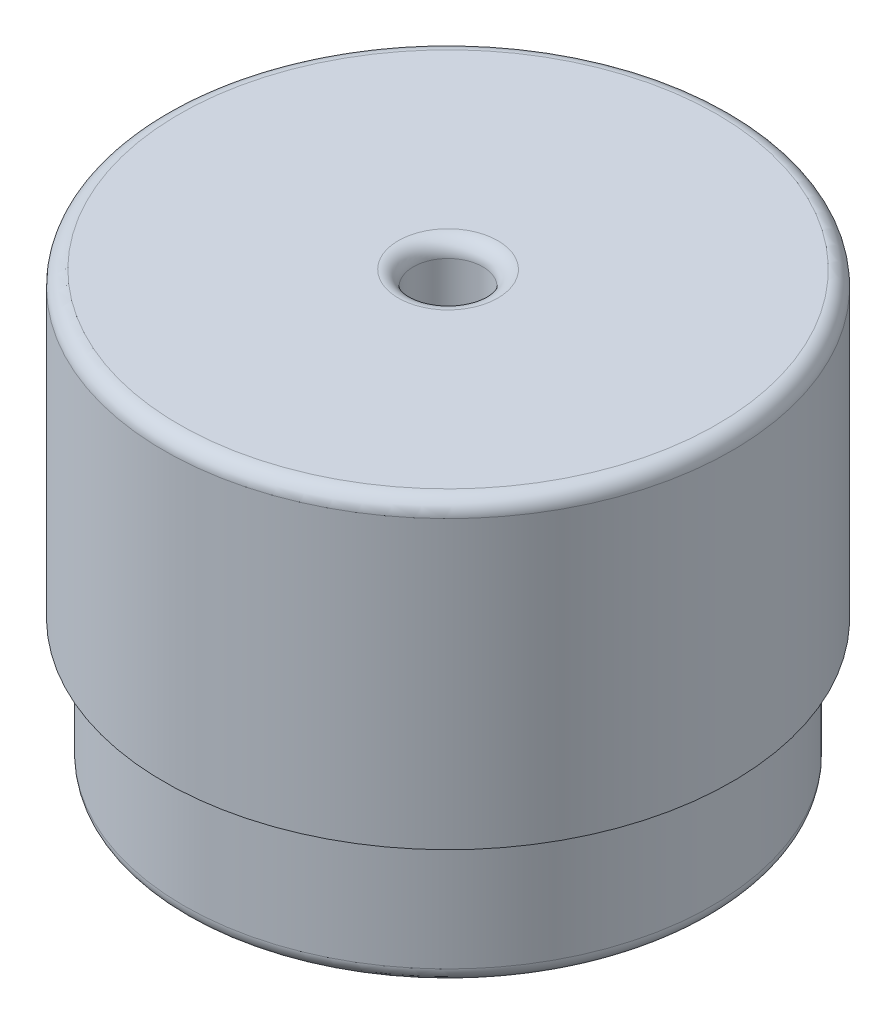
ISO-10303-21;
HEADER;
FILE_DESCRIPTION(('STEP AP214'),'2;1');
FILE_NAME('part.step','',(''),(''),'','','');
FILE_SCHEMA(('AUTOMOTIVE_DESIGN { 1 0 10303 214 1 1 1 1 }'));
ENDSEC;
DATA;
#1=APPLICATION_CONTEXT('core data for automotive mechanical design processes');
#2=APPLICATION_PROTOCOL_DEFINITION('international standard','automotive_design',2000,#1);
#3=PRODUCT_CONTEXT('',#1,'mechanical');
#4=PRODUCT('Part','Part','',(#3));
#5=PRODUCT_RELATED_PRODUCT_CATEGORY('part','',(#4));
#6=PRODUCT_DEFINITION_FORMATION('','',#4);
#7=PRODUCT_DEFINITION_CONTEXT('part definition',#1,'design');
#8=PRODUCT_DEFINITION('design','',#6,#7);
#9=PRODUCT_DEFINITION_SHAPE('','',#8);
#10=(LENGTH_UNIT() NAMED_UNIT(*) SI_UNIT(.MILLI.,.METRE.));
#11=(NAMED_UNIT(*) PLANE_ANGLE_UNIT() SI_UNIT($,.RADIAN.));
#12=(NAMED_UNIT(*) SI_UNIT($,.STERADIAN.) SOLID_ANGLE_UNIT());
#13=UNCERTAINTY_MEASURE_WITH_UNIT(LENGTH_MEASURE(1.E-05),#10,'distance_accuracy_value','');
#14=(GEOMETRIC_REPRESENTATION_CONTEXT(3) GLOBAL_UNCERTAINTY_ASSIGNED_CONTEXT((#13)) GLOBAL_UNIT_ASSIGNED_CONTEXT((#10,
#11,#12)) REPRESENTATION_CONTEXT('',''));
#15=CARTESIAN_POINT('',(0.,0.,0.));
#16=DIRECTION('',(0.,0.,1.));
#17=DIRECTION('',(1.,0.,0.));
#18=AXIS2_PLACEMENT_3D('',#15,#16,#17);
#19=CARTESIAN_POINT('',(0.,-11.8133333266984,0.));
#20=DIRECTION('',(0.,-1.,0.));
#21=DIRECTION('',(0.,0.,-1.));
#22=AXIS2_PLACEMENT_3D('',#19,#20,#21);
#23=TOROIDAL_SURFACE('',#22,5.0125,1.52);
#24=CARTESIAN_POINT('',(0.,-13.3333333266984,0.));
#25=DIRECTION('',(0.,-1.,0.));
#26=DIRECTION('',(0.,0.,-1.));
#27=AXIS2_PLACEMENT_3D('',#24,#25,#26);
#28=CIRCLE('',#27,5.0125);
#29=CARTESIAN_POINT('',(0.,-13.3333333266984,-5.0125));
#30=VERTEX_POINT('',#29);
#31=EDGE_CURVE('E10',#30,#30,#28,.T.);
#32=ORIENTED_EDGE('',*,*,#31,.T.);
#33=EDGE_LOOP('',(#32));
#34=FACE_BOUND('',#33,.T.);
#35=CARTESIAN_POINT('',(0.,-11.8133333266984,0.));
#36=DIRECTION('',(0.,-1.,0.));
#37=DIRECTION('',(0.,0.,-1.));
#38=AXIS2_PLACEMENT_3D('',#35,#36,#37);
#39=CIRCLE('',#38,3.4925);
#40=CARTESIAN_POINT('',(0.,-11.8133333266984,-3.4925));
#41=VERTEX_POINT('',#40);
#42=EDGE_CURVE('E67',#41,#41,#39,.T.);
#43=ORIENTED_EDGE('',*,*,#42,.F.);
#44=EDGE_LOOP('',(#43));
#45=FACE_BOUND('',#44,.T.);
#46=ADVANCED_FACE('F30',(#34,#45),#23,.T.);
#47=CARTESIAN_POINT('',(5.0125,-13.3333333266984,0.));
#48=DIRECTION('',(0.,-1.,0.));
#49=DIRECTION('',(0.,0.,-1.));
#50=AXIS2_PLACEMENT_3D('',#47,#48,#49);
#51=PLANE('',#50);
#52=CARTESIAN_POINT('',(0.,-13.3333333266984,0.));
#53=DIRECTION('',(0.,-1.,0.));
#54=DIRECTION('',(0.,0.,-1.));
#55=AXIS2_PLACEMENT_3D('',#52,#53,#54);
#56=CIRCLE('',#55,25.08);
#57=CARTESIAN_POINT('',(0.,-13.3333333266984,-25.08));
#58=VERTEX_POINT('',#57);
#59=EDGE_CURVE('E36',#58,#58,#56,.T.);
#60=ORIENTED_EDGE('',*,*,#59,.T.);
#61=EDGE_LOOP('',(#60));
#62=FACE_BOUND('',#61,.T.);
#63=ORIENTED_EDGE('',*,*,#31,.F.);
#64=EDGE_LOOP('',(#63));
#65=FACE_BOUND('',#64,.T.);
#66=ADVANCED_FACE('F75',(#62,#65),#51,.T.);
#67=CARTESIAN_POINT('',(0.,-11.8133333266984,0.));
#68=DIRECTION('',(0.,-1.,0.));
#69=DIRECTION('',(0.,0.,-1.));
#70=AXIS2_PLACEMENT_3D('',#67,#68,#69);
#71=TOROIDAL_SURFACE('',#70,25.08,1.52);
#72=CARTESIAN_POINT('',(0.,-11.8133333266984,0.));
#73=DIRECTION('',(0.,-1.,0.));
#74=DIRECTION('',(0.,0.,-1.));
#75=AXIS2_PLACEMENT_3D('',#72,#73,#74);
#76=CIRCLE('',#75,26.6);
#77=CARTESIAN_POINT('',(0.,-11.8133333266984,-26.6));
#78=VERTEX_POINT('',#77);
#79=EDGE_CURVE('E40',#78,#78,#76,.T.);
#80=ORIENTED_EDGE('',*,*,#79,.T.);
#81=EDGE_LOOP('',(#80));
#82=FACE_BOUND('',#81,.T.);
#83=ORIENTED_EDGE('',*,*,#59,.F.);
#84=EDGE_LOOP('',(#83));
#85=FACE_BOUND('',#84,.T.);
#86=ADVANCED_FACE('F79',(#82,#85),#71,.T.);
#87=CARTESIAN_POINT('',(0.,0.,0.));
#88=DIRECTION('',(0.,-1.,0.));
#89=DIRECTION('',(0.,0.,-1.));
#90=AXIS2_PLACEMENT_3D('',#87,#88,#89);
#91=CYLINDRICAL_SURFACE('',#90,26.6);
#92=CARTESIAN_POINT('',(0.,-0.572081158044613,0.));
#93=DIRECTION('',(0.,-1.,0.));
#94=DIRECTION('',(0.,0.,-1.));
#95=AXIS2_PLACEMENT_3D('',#92,#93,#94);
#96=CIRCLE('',#95,26.6);
#97=CARTESIAN_POINT('',(0.,-0.572081158044613,-26.6));
#98=VERTEX_POINT('',#97);
#99=EDGE_CURVE('E44',#98,#98,#96,.T.);
#100=ORIENTED_EDGE('',*,*,#99,.T.);
#101=EDGE_LOOP('',(#100));
#102=FACE_BOUND('',#101,.T.);
#103=ORIENTED_EDGE('',*,*,#79,.F.);
#104=EDGE_LOOP('',(#103));
#105=FACE_BOUND('',#104,.T.);
#106=ADVANCED_FACE('F83',(#102,#105),#91,.T.);
#107=CARTESIAN_POINT('',(0.,-0.572081158044613,0.));
#108=DIRECTION('',(0.,-1.,0.));
#109=DIRECTION('',(0.,0.,-1.));
#110=AXIS2_PLACEMENT_3D('',#107,#108,#109);
#111=TOROIDAL_SURFACE('',#110,27.1720811580446,0.572081158044614);
#112=CARTESIAN_POINT('',(0.,0.,0.));
#113=DIRECTION('',(0.,-1.,0.));
#114=DIRECTION('',(0.,0.,-1.));
#115=AXIS2_PLACEMENT_3D('',#112,#113,#114);
#116=CIRCLE('',#115,27.1720811580446);
#117=CARTESIAN_POINT('',(0.,0.,-27.1720811580446));
#118=VERTEX_POINT('',#117);
#119=EDGE_CURVE('E49',#118,#118,#116,.T.);
#120=ORIENTED_EDGE('',*,*,#119,.T.);
#121=EDGE_LOOP('',(#120));
#122=FACE_BOUND('',#121,.T.);
#123=ORIENTED_EDGE('',*,*,#99,.F.);
#124=EDGE_LOOP('',(#123));
#125=FACE_BOUND('',#124,.T.);
#126=ADVANCED_FACE('F90',(#122,#125),#111,.F.);
#127=CARTESIAN_POINT('',(27.1720811580446,0.,0.));
#128=DIRECTION('',(0.,-1.,0.));
#129=DIRECTION('',(0.,0.,-1.));
#130=AXIS2_PLACEMENT_3D('',#127,#128,#129);
#131=PLANE('',#130);
#132=CARTESIAN_POINT('',(0.,0.,0.));
#133=DIRECTION('',(0.,-1.,0.));
#134=DIRECTION('',(0.,0.,-1.));
#135=AXIS2_PLACEMENT_3D('',#132,#133,#134);
#136=CIRCLE('',#135,28.6);
#137=CARTESIAN_POINT('',(0.,0.,-28.6));
#138=VERTEX_POINT('',#137);
#139=EDGE_CURVE('E52',#138,#138,#136,.T.);
#140=ORIENTED_EDGE('',*,*,#139,.T.);
#141=EDGE_LOOP('',(#140));
#142=FACE_BOUND('',#141,.T.);
#143=ORIENTED_EDGE('',*,*,#119,.F.);
#144=EDGE_LOOP('',(#143));
#145=FACE_BOUND('',#144,.T.);
#146=ADVANCED_FACE('F94',(#142,#145),#131,.T.);
#147=CARTESIAN_POINT('',(0.,0.,0.));
#148=DIRECTION('',(0.,-1.,0.));
#149=DIRECTION('',(0.,0.,-1.));
#150=AXIS2_PLACEMENT_3D('',#147,#148,#149);
#151=CYLINDRICAL_SURFACE('',#150,28.6);
#152=CARTESIAN_POINT('',(0.,28.88,0.));
#153=DIRECTION('',(0.,-1.,0.));
#154=DIRECTION('',(0.,0.,-1.));
#155=AXIS2_PLACEMENT_3D('',#152,#153,#154);
#156=CIRCLE('',#155,28.6);
#157=CARTESIAN_POINT('',(0.,28.88,-28.6));
#158=VERTEX_POINT('',#157);
#159=EDGE_CURVE('E55',#158,#158,#156,.T.);
#160=ORIENTED_EDGE('',*,*,#159,.T.);
#161=EDGE_LOOP('',(#160));
#162=FACE_BOUND('',#161,.T.);
#163=ORIENTED_EDGE('',*,*,#139,.F.);
#164=EDGE_LOOP('',(#163));
#165=FACE_BOUND('',#164,.T.);
#166=ADVANCED_FACE('F98',(#162,#165),#151,.T.);
#167=CARTESIAN_POINT('',(0.,28.88,0.));
#168=DIRECTION('',(0.,-1.,0.));
#169=DIRECTION('',(0.,0.,-1.));
#170=AXIS2_PLACEMENT_3D('',#167,#168,#169);
#171=TOROIDAL_SURFACE('',#170,27.08,1.52);
#172=CARTESIAN_POINT('',(0.,30.4,0.));
#173=DIRECTION('',(0.,-1.,0.));
#174=DIRECTION('',(0.,0.,-1.));
#175=AXIS2_PLACEMENT_3D('',#172,#173,#174);
#176=CIRCLE('',#175,27.08);
#177=CARTESIAN_POINT('',(0.,30.4,-27.08));
#178=VERTEX_POINT('',#177);
#179=EDGE_CURVE('E58',#178,#178,#176,.T.);
#180=ORIENTED_EDGE('',*,*,#179,.T.);
#181=EDGE_LOOP('',(#180));
#182=FACE_BOUND('',#181,.T.);
#183=ORIENTED_EDGE('',*,*,#159,.F.);
#184=EDGE_LOOP('',(#183));
#185=FACE_BOUND('',#184,.T.);
#186=ADVANCED_FACE('F102',(#182,#185),#171,.T.);
#187=CARTESIAN_POINT('',(5.0125,30.4,0.));
#188=DIRECTION('',(0.,1.,0.));
#189=DIRECTION('',(0.,0.,1.));
#190=AXIS2_PLACEMENT_3D('',#187,#188,#189);
#191=PLANE('',#190);
#192=CARTESIAN_POINT('',(0.,30.4,0.));
#193=DIRECTION('',(0.,-1.,0.));
#194=DIRECTION('',(0.,0.,-1.));
#195=AXIS2_PLACEMENT_3D('',#192,#193,#194);
#196=CIRCLE('',#195,5.0125);
#197=CARTESIAN_POINT('',(0.,30.4,-5.0125));
#198=VERTEX_POINT('',#197);
#199=EDGE_CURVE('E61',#198,#198,#196,.T.);
#200=ORIENTED_EDGE('',*,*,#199,.T.);
#201=EDGE_LOOP('',(#200));
#202=FACE_BOUND('',#201,.T.);
#203=ORIENTED_EDGE('',*,*,#179,.F.);
#204=EDGE_LOOP('',(#203));
#205=FACE_BOUND('',#204,.T.);
#206=ADVANCED_FACE('F106',(#202,#205),#191,.T.);
#207=CARTESIAN_POINT('',(0.,28.88,0.));
#208=DIRECTION('',(0.,-1.,0.));
#209=DIRECTION('',(0.,0.,-1.));
#210=AXIS2_PLACEMENT_3D('',#207,#208,#209);
#211=TOROIDAL_SURFACE('',#210,5.0125,1.52);
#212=CARTESIAN_POINT('',(0.,28.88,0.));
#213=DIRECTION('',(0.,-1.,0.));
#214=DIRECTION('',(0.,0.,-1.));
#215=AXIS2_PLACEMENT_3D('',#212,#213,#214);
#216=CIRCLE('',#215,3.4925);
#217=CARTESIAN_POINT('',(0.,28.88,-3.4925));
#218=VERTEX_POINT('',#217);
#219=EDGE_CURVE('E64',#218,#218,#216,.T.);
#220=ORIENTED_EDGE('',*,*,#219,.T.);
#221=EDGE_LOOP('',(#220));
#222=FACE_BOUND('',#221,.T.);
#223=ORIENTED_EDGE('',*,*,#199,.F.);
#224=EDGE_LOOP('',(#223));
#225=FACE_BOUND('',#224,.T.);
#226=ADVANCED_FACE('F110',(#222,#225),#211,.T.);
#227=CARTESIAN_POINT('',(0.,0.,0.));
#228=DIRECTION('',(0.,-1.,0.));
#229=DIRECTION('',(0.,0.,-1.));
#230=AXIS2_PLACEMENT_3D('',#227,#228,#229);
#231=CYLINDRICAL_SURFACE('',#230,3.4925);
#232=ORIENTED_EDGE('',*,*,#42,.T.);
#233=EDGE_LOOP('',(#232));
#234=FACE_BOUND('',#233,.T.);
#235=ORIENTED_EDGE('',*,*,#219,.F.);
#236=EDGE_LOOP('',(#235));
#237=FACE_BOUND('',#236,.T.);
#238=ADVANCED_FACE('F71',(#234,#237),#231,.F.);
#239=CLOSED_SHELL('',(#46,#66,#86,#106,#126,#146,#166,#186,#206,#226,#238));
#240=MANIFOLD_SOLID_BREP('B2',#239);
#241=ADVANCED_BREP_SHAPE_REPRESENTATION('',(#18,#240),#14);
#242=SHAPE_DEFINITION_REPRESENTATION(#9,#241);
ENDSEC;
END-ISO-10303-21;
